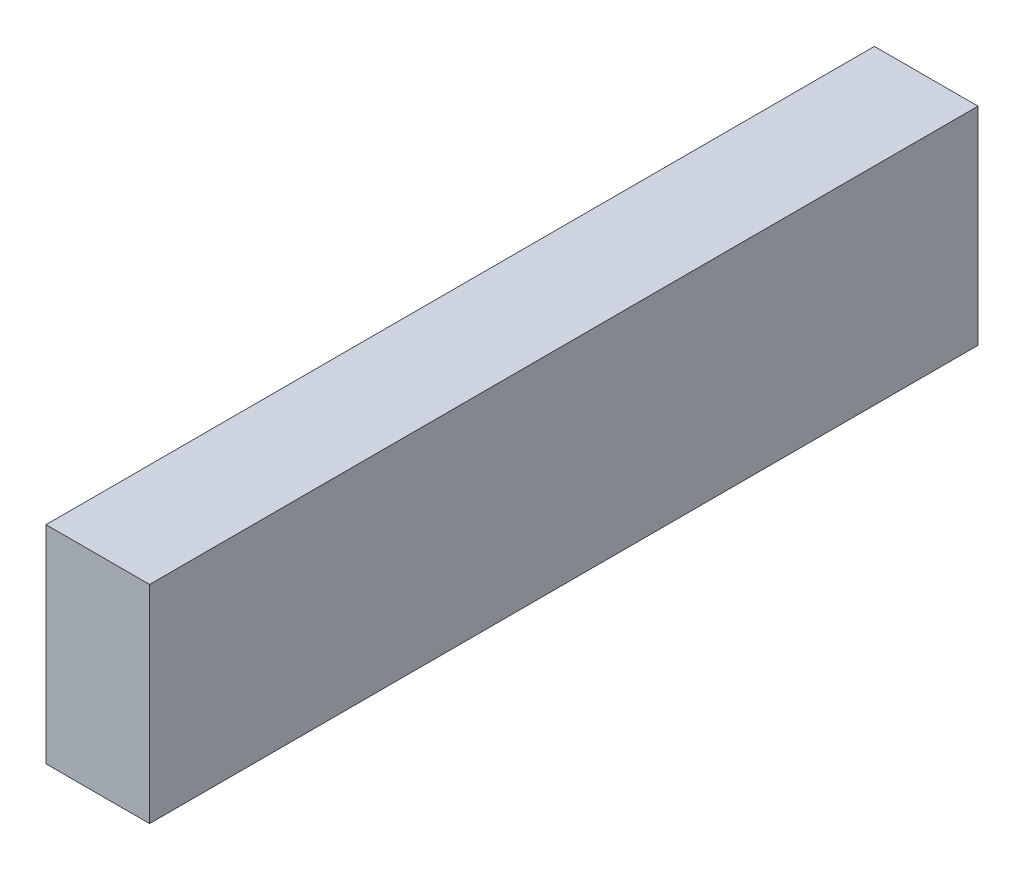
ISO-10303-21;
HEADER;
FILE_DESCRIPTION(('STEP AP214'),'2;1');
FILE_NAME('part.step','',(''),(''),'','','');
FILE_SCHEMA(('AUTOMOTIVE_DESIGN { 1 0 10303 214 1 1 1 1 }'));
ENDSEC;
DATA;
#1=APPLICATION_CONTEXT('core data for automotive mechanical design processes');
#2=APPLICATION_PROTOCOL_DEFINITION('international standard','automotive_design',2000,#1);
#3=PRODUCT_CONTEXT('',#1,'mechanical');
#4=PRODUCT('Part','Part','',(#3));
#5=PRODUCT_RELATED_PRODUCT_CATEGORY('part','',(#4));
#6=PRODUCT_DEFINITION_FORMATION('','',#4);
#7=PRODUCT_DEFINITION_CONTEXT('part definition',#1,'design');
#8=PRODUCT_DEFINITION('design','',#6,#7);
#9=PRODUCT_DEFINITION_SHAPE('','',#8);
#10=(LENGTH_UNIT() NAMED_UNIT(*) SI_UNIT(.MILLI.,.METRE.));
#11=(NAMED_UNIT(*) PLANE_ANGLE_UNIT() SI_UNIT($,.RADIAN.));
#12=(NAMED_UNIT(*) SI_UNIT($,.STERADIAN.) SOLID_ANGLE_UNIT());
#13=UNCERTAINTY_MEASURE_WITH_UNIT(LENGTH_MEASURE(1.E-05),#10,'distance_accuracy_value','');
#14=(GEOMETRIC_REPRESENTATION_CONTEXT(3) GLOBAL_UNCERTAINTY_ASSIGNED_CONTEXT((#13)) GLOBAL_UNIT_ASSIGNED_CONTEXT((#10,
#11,#12)) REPRESENTATION_CONTEXT('',''));
#15=CARTESIAN_POINT('',(0.,0.,0.));
#16=DIRECTION('',(0.,0.,1.));
#17=DIRECTION('',(1.,0.,0.));
#18=AXIS2_PLACEMENT_3D('',#15,#16,#17);
#19=CARTESIAN_POINT('',(3.17500000000001,-6.34999999999999,50.8));
#20=DIRECTION('',(-1.,0.,0.));
#21=DIRECTION('',(0.,0.,1.));
#22=AXIS2_PLACEMENT_3D('',#19,#20,#21);
#23=PLANE('',#22);
#24=DIRECTION('',(0.,1.,0.));
#25=VECTOR('',#24,1.);
#26=CARTESIAN_POINT('',(3.17500000000001,-6.34999999999999,0.));
#27=LINE('',#26,#25);
#28=CARTESIAN_POINT('',(3.17500000000001,-6.34999999999999,0.));
#29=VERTEX_POINT('',#28);
#30=CARTESIAN_POINT('',(3.17500000000001,6.35000000000001,0.));
#31=VERTEX_POINT('',#30);
#32=EDGE_CURVE('E101',#29,#31,#27,.T.);
#33=ORIENTED_EDGE('',*,*,#32,.T.);
#34=DIRECTION('',(0.,0.,-1.));
#35=VECTOR('',#34,1.);
#36=CARTESIAN_POINT('',(3.17500000000001,6.35000000000001,50.8));
#37=LINE('',#36,#35);
#38=CARTESIAN_POINT('',(3.17500000000001,6.35000000000001,50.8));
#39=VERTEX_POINT('',#38);
#40=EDGE_CURVE('E11',#39,#31,#37,.T.);
#41=ORIENTED_EDGE('',*,*,#40,.F.);
#42=DIRECTION('',(0.,1.,0.));
#43=VECTOR('',#42,1.);
#44=CARTESIAN_POINT('',(3.17500000000001,-6.34999999999999,50.8));
#45=LINE('',#44,#43);
#46=CARTESIAN_POINT('',(3.17500000000001,-6.34999999999999,50.8));
#47=VERTEX_POINT('',#46);
#48=EDGE_CURVE('E89',#47,#39,#45,.T.);
#49=ORIENTED_EDGE('',*,*,#48,.F.);
#50=DIRECTION('',(0.,0.,-1.));
#51=VECTOR('',#50,1.);
#52=CARTESIAN_POINT('',(3.17500000000001,-6.34999999999999,50.8));
#53=LINE('',#52,#51);
#54=EDGE_CURVE('E97',#47,#29,#53,.T.);
#55=ORIENTED_EDGE('',*,*,#54,.T.);
#56=EDGE_LOOP('',(#33,#41,#49,#55));
#57=FACE_BOUND('',#56,.T.);
#58=ADVANCED_FACE('F38',(#57),#23,.F.);
#59=CARTESIAN_POINT('',(-3.17499999999999,6.35000000000001,50.8));
#60=DIRECTION('',(0.,-1.,0.));
#61=DIRECTION('',(0.,0.,-1.));
#62=AXIS2_PLACEMENT_3D('',#59,#60,#61);
#63=PLANE('',#62);
#64=DIRECTION('',(-1.,0.,0.));
#65=VECTOR('',#64,1.);
#66=CARTESIAN_POINT('',(-3.17499999999999,6.35000000000001,0.));
#67=LINE('',#66,#65);
#68=CARTESIAN_POINT('',(-3.17499999999999,6.35000000000001,0.));
#69=VERTEX_POINT('',#68);
#70=EDGE_CURVE('E93',#31,#69,#67,.T.);
#71=ORIENTED_EDGE('',*,*,#70,.T.);
#72=DIRECTION('',(0.,0.,-1.));
#73=VECTOR('',#72,1.);
#74=CARTESIAN_POINT('',(-3.17499999999999,6.35000000000001,50.8));
#75=LINE('',#74,#73);
#76=CARTESIAN_POINT('',(-3.17499999999999,6.35000000000001,50.8));
#77=VERTEX_POINT('',#76);
#78=EDGE_CURVE('E46',#77,#69,#75,.T.);
#79=ORIENTED_EDGE('',*,*,#78,.F.);
#80=DIRECTION('',(-1.,0.,0.));
#81=VECTOR('',#80,1.);
#82=CARTESIAN_POINT('',(-3.17499999999999,6.35000000000001,50.8));
#83=LINE('',#82,#81);
#84=EDGE_CURVE('E84',#39,#77,#83,.T.);
#85=ORIENTED_EDGE('',*,*,#84,.F.);
#86=ORIENTED_EDGE('',*,*,#40,.T.);
#87=EDGE_LOOP('',(#71,#79,#85,#86));
#88=FACE_BOUND('',#87,.T.);
#89=ADVANCED_FACE('F92',(#88),#63,.F.);
#90=CARTESIAN_POINT('',(-3.17499999999999,-6.34999999999999,50.8));
#91=DIRECTION('',(1.,0.,0.));
#92=DIRECTION('',(0.,0.,-1.));
#93=AXIS2_PLACEMENT_3D('',#90,#91,#92);
#94=PLANE('',#93);
#95=DIRECTION('',(0.,-1.,0.));
#96=VECTOR('',#95,1.);
#97=CARTESIAN_POINT('',(-3.17499999999999,-6.34999999999999,0.));
#98=LINE('',#97,#96);
#99=CARTESIAN_POINT('',(-3.17499999999999,-6.34999999999999,0.));
#100=VERTEX_POINT('',#99);
#101=EDGE_CURVE('E71',#69,#100,#98,.T.);
#102=ORIENTED_EDGE('',*,*,#101,.T.);
#103=DIRECTION('',(0.,0.,-1.));
#104=VECTOR('',#103,1.);
#105=CARTESIAN_POINT('',(-3.17499999999999,-6.34999999999999,50.8));
#106=LINE('',#105,#104);
#107=CARTESIAN_POINT('',(-3.17499999999999,-6.34999999999999,50.8));
#108=VERTEX_POINT('',#107);
#109=EDGE_CURVE('E94',#108,#100,#106,.T.);
#110=ORIENTED_EDGE('',*,*,#109,.F.);
#111=DIRECTION('',(0.,-1.,0.));
#112=VECTOR('',#111,1.);
#113=CARTESIAN_POINT('',(-3.17499999999999,-6.34999999999999,50.8));
#114=LINE('',#113,#112);
#115=EDGE_CURVE('E87',#77,#108,#114,.T.);
#116=ORIENTED_EDGE('',*,*,#115,.F.);
#117=ORIENTED_EDGE('',*,*,#78,.T.);
#118=EDGE_LOOP('',(#102,#110,#116,#117));
#119=FACE_BOUND('',#118,.T.);
#120=ADVANCED_FACE('F95',(#119),#94,.F.);
#121=CARTESIAN_POINT('',(-3.17499999999999,-6.34999999999999,50.8));
#122=DIRECTION('',(0.,1.,0.));
#123=DIRECTION('',(0.,0.,1.));
#124=AXIS2_PLACEMENT_3D('',#121,#122,#123);
#125=PLANE('',#124);
#126=DIRECTION('',(1.,0.,0.));
#127=VECTOR('',#126,1.);
#128=CARTESIAN_POINT('',(-3.17499999999999,-6.34999999999999,0.));
#129=LINE('',#128,#127);
#130=EDGE_CURVE('E77',#100,#29,#129,.T.);
#131=ORIENTED_EDGE('',*,*,#130,.T.);
#132=ORIENTED_EDGE('',*,*,#54,.F.);
#133=DIRECTION('',(1.,0.,0.));
#134=VECTOR('',#133,1.);
#135=CARTESIAN_POINT('',(-3.17499999999999,-6.34999999999999,50.8));
#136=LINE('',#135,#134);
#137=EDGE_CURVE('E54',#108,#47,#136,.T.);
#138=ORIENTED_EDGE('',*,*,#137,.F.);
#139=ORIENTED_EDGE('',*,*,#109,.T.);
#140=EDGE_LOOP('',(#131,#132,#138,#139));
#141=FACE_BOUND('',#140,.T.);
#142=ADVANCED_FACE('F108',(#141),#125,.F.);
#143=CARTESIAN_POINT('',(3.17500000000001,6.35000000000001,50.8));
#144=DIRECTION('',(0.,0.,-1.));
#145=DIRECTION('',(-1.,0.,0.));
#146=AXIS2_PLACEMENT_3D('',#143,#144,#145);
#147=PLANE('',#146);
#148=ORIENTED_EDGE('',*,*,#48,.T.);
#149=ORIENTED_EDGE('',*,*,#84,.T.);
#150=ORIENTED_EDGE('',*,*,#115,.T.);
#151=ORIENTED_EDGE('',*,*,#137,.T.);
#152=EDGE_LOOP('',(#148,#149,#150,#151));
#153=FACE_BOUND('',#152,.T.);
#154=ADVANCED_FACE('F85',(#153),#147,.F.);
#155=CARTESIAN_POINT('',(3.17500000000001,6.35000000000001,0.));
#156=DIRECTION('',(0.,0.,-1.));
#157=DIRECTION('',(-1.,0.,0.));
#158=AXIS2_PLACEMENT_3D('',#155,#156,#157);
#159=PLANE('',#158);
#160=ORIENTED_EDGE('',*,*,#32,.F.);
#161=ORIENTED_EDGE('',*,*,#130,.F.);
#162=ORIENTED_EDGE('',*,*,#101,.F.);
#163=ORIENTED_EDGE('',*,*,#70,.F.);
#164=EDGE_LOOP('',(#160,#161,#162,#163));
#165=FACE_BOUND('',#164,.T.);
#166=ADVANCED_FACE('F111',(#165),#159,.T.);
#167=CLOSED_SHELL('',(#58,#89,#120,#142,#154,#166));
#168=MANIFOLD_SOLID_BREP('B2',#167);
#169=ADVANCED_BREP_SHAPE_REPRESENTATION('',(#18,#168),#14);
#170=SHAPE_DEFINITION_REPRESENTATION(#9,#169);
ENDSEC;
END-ISO-10303-21;
